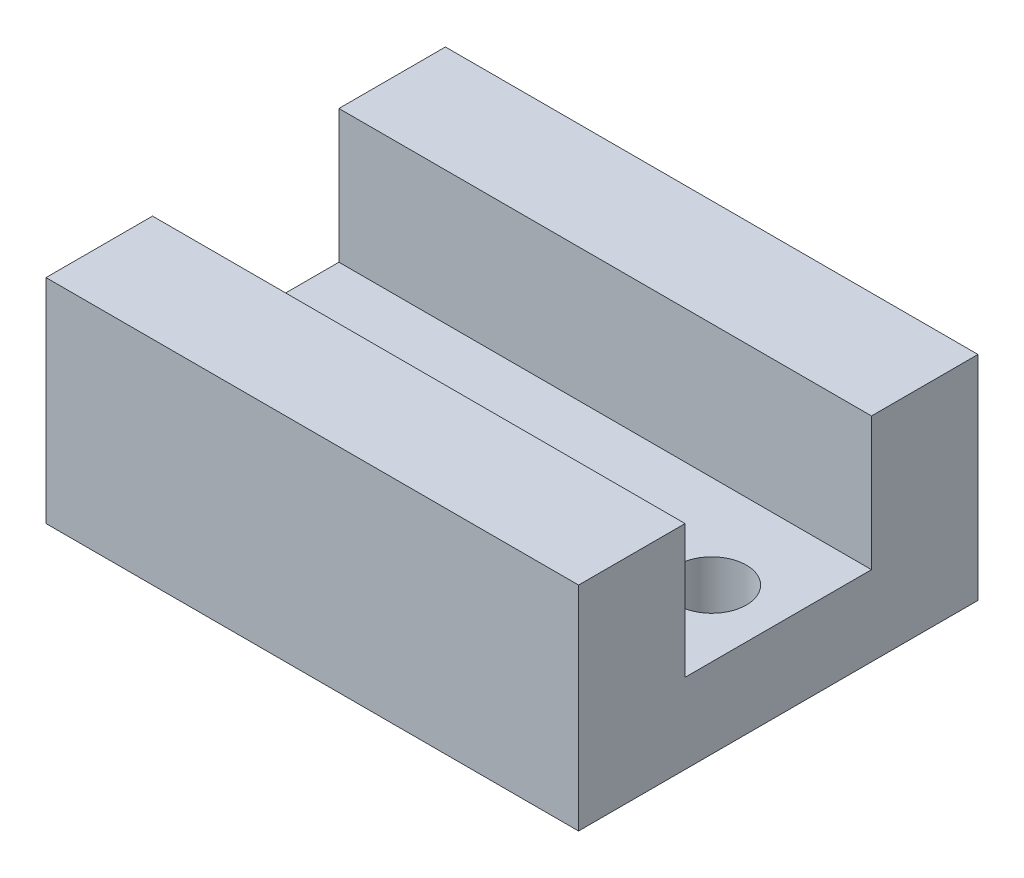
ISO-10303-21;
HEADER;
FILE_DESCRIPTION(('STEP AP214'),'2;1');
FILE_NAME('part.step','',(''),(''),'','','');
FILE_SCHEMA(('AUTOMOTIVE_DESIGN { 1 0 10303 214 1 1 1 1 }'));
ENDSEC;
DATA;
#1=APPLICATION_CONTEXT('core data for automotive mechanical design processes');
#2=APPLICATION_PROTOCOL_DEFINITION('international standard','automotive_design',2000,#1);
#3=PRODUCT_CONTEXT('',#1,'mechanical');
#4=PRODUCT('Part','Part','',(#3));
#5=PRODUCT_RELATED_PRODUCT_CATEGORY('part','',(#4));
#6=PRODUCT_DEFINITION_FORMATION('','',#4);
#7=PRODUCT_DEFINITION_CONTEXT('part definition',#1,'design');
#8=PRODUCT_DEFINITION('design','',#6,#7);
#9=PRODUCT_DEFINITION_SHAPE('','',#8);
#10=(LENGTH_UNIT() NAMED_UNIT(*) SI_UNIT(.MILLI.,.METRE.));
#11=(NAMED_UNIT(*) PLANE_ANGLE_UNIT() SI_UNIT($,.RADIAN.));
#12=(NAMED_UNIT(*) SI_UNIT($,.STERADIAN.) SOLID_ANGLE_UNIT());
#13=UNCERTAINTY_MEASURE_WITH_UNIT(LENGTH_MEASURE(1.E-05),#10,'distance_accuracy_value','');
#14=(GEOMETRIC_REPRESENTATION_CONTEXT(3) GLOBAL_UNCERTAINTY_ASSIGNED_CONTEXT((#13)) GLOBAL_UNIT_ASSIGNED_CONTEXT((#10,
#11,#12)) REPRESENTATION_CONTEXT('',''));
#15=CARTESIAN_POINT('',(0.,0.,0.));
#16=DIRECTION('',(0.,0.,1.));
#17=DIRECTION('',(1.,0.,0.));
#18=AXIS2_PLACEMENT_3D('',#15,#16,#17);
#19=CARTESIAN_POINT('',(0.,3.,0.));
#20=DIRECTION('',(0.,1.,0.));
#21=DIRECTION('',(0.,0.,1.));
#22=AXIS2_PLACEMENT_3D('',#19,#20,#21);
#23=PLANE('',#22);
#24=CARTESIAN_POINT('',(7.5,3.,0.));
#25=DIRECTION('',(0.,1.,0.));
#26=DIRECTION('',(0.,0.,1.));
#27=AXIS2_PLACEMENT_3D('',#24,#25,#26);
#28=CIRCLE('',#27,1.3);
#29=CARTESIAN_POINT('',(7.5,3.,1.3));
#30=VERTEX_POINT('',#29);
#31=EDGE_CURVE('E182',#30,#30,#28,.T.);
#32=ORIENTED_EDGE('',*,*,#31,.F.);
#33=EDGE_LOOP('',(#32));
#34=FACE_BOUND('',#33,.T.);
#35=CARTESIAN_POINT('',(-7.5,3.,0.));
#36=DIRECTION('',(0.,1.,0.));
#37=DIRECTION('',(0.,0.,1.));
#38=AXIS2_PLACEMENT_3D('',#35,#36,#37);
#39=CIRCLE('',#38,1.3);
#40=CARTESIAN_POINT('',(-7.5,3.,1.3));
#41=VERTEX_POINT('',#40);
#42=EDGE_CURVE('E174',#41,#41,#39,.T.);
#43=ORIENTED_EDGE('',*,*,#42,.F.);
#44=EDGE_LOOP('',(#43));
#45=FACE_BOUND('',#44,.T.);
#46=DIRECTION('',(0.,0.,1.));
#47=VECTOR('',#46,1.);
#48=CARTESIAN_POINT('',(-10.,3.,-7.5));
#49=LINE('',#48,#47);
#50=CARTESIAN_POINT('',(-10.,3.,-3.5));
#51=VERTEX_POINT('',#50);
#52=CARTESIAN_POINT('',(-10.,3.,3.5));
#53=VERTEX_POINT('',#52);
#54=EDGE_CURVE('E60',#51,#53,#49,.T.);
#55=ORIENTED_EDGE('',*,*,#54,.T.);
#56=DIRECTION('',(-1.,0.,0.));
#57=VECTOR('',#56,1.);
#58=CARTESIAN_POINT('',(-10.,3.,3.5));
#59=LINE('',#58,#57);
#60=CARTESIAN_POINT('',(10.,3.,3.5));
#61=VERTEX_POINT('',#60);
#62=EDGE_CURVE('E55',#61,#53,#59,.T.);
#63=ORIENTED_EDGE('',*,*,#62,.F.);
#64=DIRECTION('',(0.,0.,-1.));
#65=VECTOR('',#64,1.);
#66=CARTESIAN_POINT('',(10.,3.,-7.5));
#67=LINE('',#66,#65);
#68=CARTESIAN_POINT('',(10.,3.,-3.5));
#69=VERTEX_POINT('',#68);
#70=EDGE_CURVE('E190',#61,#69,#67,.T.);
#71=ORIENTED_EDGE('',*,*,#70,.T.);
#72=DIRECTION('',(1.,0.,0.));
#73=VECTOR('',#72,1.);
#74=CARTESIAN_POINT('',(-10.,3.,-3.5));
#75=LINE('',#74,#73);
#76=EDGE_CURVE('E146',#51,#69,#75,.T.);
#77=ORIENTED_EDGE('',*,*,#76,.F.);
#78=EDGE_LOOP('',(#55,#63,#71,#77));
#79=FACE_BOUND('',#78,.T.);
#80=ADVANCED_FACE('F39',(#34,#45,#79),#23,.T.);
#81=CARTESIAN_POINT('',(0.,0.,0.));
#82=DIRECTION('',(0.,1.,0.));
#83=DIRECTION('',(0.,0.,1.));
#84=AXIS2_PLACEMENT_3D('',#81,#82,#83);
#85=PLANE('',#84);
#86=DIRECTION('',(0.,0.,-1.));
#87=VECTOR('',#86,1.);
#88=CARTESIAN_POINT('',(10.,0.,-7.5));
#89=LINE('',#88,#87);
#90=CARTESIAN_POINT('',(10.,0.,7.5));
#91=VERTEX_POINT('',#90);
#92=CARTESIAN_POINT('',(10.,0.,-7.5));
#93=VERTEX_POINT('',#92);
#94=EDGE_CURVE('E186',#91,#93,#89,.T.);
#95=ORIENTED_EDGE('',*,*,#94,.F.);
#96=DIRECTION('',(1.,0.,0.));
#97=VECTOR('',#96,1.);
#98=CARTESIAN_POINT('',(-10.,0.,7.5));
#99=LINE('',#98,#97);
#100=CARTESIAN_POINT('',(-10.,0.,7.5));
#101=VERTEX_POINT('',#100);
#102=EDGE_CURVE('E193',#101,#91,#99,.T.);
#103=ORIENTED_EDGE('',*,*,#102,.F.);
#104=DIRECTION('',(0.,0.,1.));
#105=VECTOR('',#104,1.);
#106=CARTESIAN_POINT('',(-10.,0.,-7.5));
#107=LINE('',#106,#105);
#108=CARTESIAN_POINT('',(-10.,0.,-7.5));
#109=VERTEX_POINT('',#108);
#110=EDGE_CURVE('E111',#109,#101,#107,.T.);
#111=ORIENTED_EDGE('',*,*,#110,.F.);
#112=DIRECTION('',(-1.,0.,0.));
#113=VECTOR('',#112,1.);
#114=CARTESIAN_POINT('',(-10.,0.,-7.5));
#115=LINE('',#114,#113);
#116=EDGE_CURVE('E199',#93,#109,#115,.T.);
#117=ORIENTED_EDGE('',*,*,#116,.F.);
#118=EDGE_LOOP('',(#95,#103,#111,#117));
#119=FACE_BOUND('',#118,.T.);
#120=CARTESIAN_POINT('',(7.5,0.,0.));
#121=DIRECTION('',(0.,1.,0.));
#122=DIRECTION('',(0.,0.,1.));
#123=AXIS2_PLACEMENT_3D('',#120,#121,#122);
#124=CIRCLE('',#123,1.3);
#125=CARTESIAN_POINT('',(7.5,0.,1.3));
#126=VERTEX_POINT('',#125);
#127=EDGE_CURVE('E178',#126,#126,#124,.T.);
#128=ORIENTED_EDGE('',*,*,#127,.T.);
#129=EDGE_LOOP('',(#128));
#130=FACE_BOUND('',#129,.T.);
#131=CARTESIAN_POINT('',(-7.5,0.,0.));
#132=DIRECTION('',(0.,1.,0.));
#133=DIRECTION('',(0.,0.,1.));
#134=AXIS2_PLACEMENT_3D('',#131,#132,#133);
#135=CIRCLE('',#134,1.3);
#136=CARTESIAN_POINT('',(-7.5,0.,1.3));
#137=VERTEX_POINT('',#136);
#138=EDGE_CURVE('E173',#137,#137,#135,.T.);
#139=ORIENTED_EDGE('',*,*,#138,.T.);
#140=EDGE_LOOP('',(#139));
#141=FACE_BOUND('',#140,.T.);
#142=ADVANCED_FACE('F214',(#119,#130,#141),#85,.F.);
#143=CARTESIAN_POINT('',(10.,3.,-7.5));
#144=DIRECTION('',(-1.,0.,0.));
#145=DIRECTION('',(0.,0.,1.));
#146=AXIS2_PLACEMENT_3D('',#143,#144,#145);
#147=PLANE('',#146);
#148=ORIENTED_EDGE('',*,*,#94,.T.);
#149=DIRECTION('',(0.,-1.,0.));
#150=VECTOR('',#149,1.);
#151=CARTESIAN_POINT('',(10.,3.,-7.5));
#152=LINE('',#151,#150);
#153=CARTESIAN_POINT('',(10.,8.,-7.5));
#154=VERTEX_POINT('',#153);
#155=EDGE_CURVE('E11',#154,#93,#152,.T.);
#156=ORIENTED_EDGE('',*,*,#155,.F.);
#157=DIRECTION('',(0.,0.,-1.));
#158=VECTOR('',#157,1.);
#159=CARTESIAN_POINT('',(10.,8.,-7.5));
#160=LINE('',#159,#158);
#161=CARTESIAN_POINT('',(10.,8.,-3.5));
#162=VERTEX_POINT('',#161);
#163=EDGE_CURVE('E154',#162,#154,#160,.T.);
#164=ORIENTED_EDGE('',*,*,#163,.F.);
#165=DIRECTION('',(0.,-1.,0.));
#166=VECTOR('',#165,1.);
#167=CARTESIAN_POINT('',(10.,8.,-3.5));
#168=LINE('',#167,#166);
#169=EDGE_CURVE('E162',#162,#69,#168,.T.);
#170=ORIENTED_EDGE('',*,*,#169,.T.);
#171=ORIENTED_EDGE('',*,*,#70,.F.);
#172=DIRECTION('',(0.,-1.,0.));
#173=VECTOR('',#172,1.);
#174=CARTESIAN_POINT('',(10.,8.,3.5));
#175=LINE('',#174,#173);
#176=CARTESIAN_POINT('',(10.,8.,3.5));
#177=VERTEX_POINT('',#176);
#178=EDGE_CURVE('E142',#177,#61,#175,.T.);
#179=ORIENTED_EDGE('',*,*,#178,.F.);
#180=DIRECTION('',(0.,0.,-1.));
#181=VECTOR('',#180,1.);
#182=CARTESIAN_POINT('',(10.,8.,7.5));
#183=LINE('',#182,#181);
#184=CARTESIAN_POINT('',(10.,8.,7.5));
#185=VERTEX_POINT('',#184);
#186=EDGE_CURVE('E124',#185,#177,#183,.T.);
#187=ORIENTED_EDGE('',*,*,#186,.F.);
#188=DIRECTION('',(0.,-1.,0.));
#189=VECTOR('',#188,1.);
#190=CARTESIAN_POINT('',(10.,3.,7.5));
#191=LINE('',#190,#189);
#192=EDGE_CURVE('E115',#185,#91,#191,.T.);
#193=ORIENTED_EDGE('',*,*,#192,.T.);
#194=EDGE_LOOP('',(#148,#156,#164,#170,#171,#179,#187,#193));
#195=FACE_BOUND('',#194,.T.);
#196=ADVANCED_FACE('F41',(#195),#147,.F.);
#197=CARTESIAN_POINT('',(-10.,3.,-7.5));
#198=DIRECTION('',(0.,0.,1.));
#199=DIRECTION('',(1.,0.,0.));
#200=AXIS2_PLACEMENT_3D('',#197,#198,#199);
#201=PLANE('',#200);
#202=ORIENTED_EDGE('',*,*,#116,.T.);
#203=DIRECTION('',(0.,-1.,0.));
#204=VECTOR('',#203,1.);
#205=CARTESIAN_POINT('',(-10.,3.,-7.5));
#206=LINE('',#205,#204);
#207=CARTESIAN_POINT('',(-10.,8.,-7.5));
#208=VERTEX_POINT('',#207);
#209=EDGE_CURVE('E48',#208,#109,#206,.T.);
#210=ORIENTED_EDGE('',*,*,#209,.F.);
#211=DIRECTION('',(-1.,0.,0.));
#212=VECTOR('',#211,1.);
#213=CARTESIAN_POINT('',(-10.,8.,-7.5));
#214=LINE('',#213,#212);
#215=EDGE_CURVE('E158',#154,#208,#214,.T.);
#216=ORIENTED_EDGE('',*,*,#215,.F.);
#217=ORIENTED_EDGE('',*,*,#155,.T.);
#218=EDGE_LOOP('',(#202,#210,#216,#217));
#219=FACE_BOUND('',#218,.T.);
#220=ADVANCED_FACE('F226',(#219),#201,.F.);
#221=CARTESIAN_POINT('',(-10.,3.,-7.5));
#222=DIRECTION('',(1.,0.,0.));
#223=DIRECTION('',(0.,0.,-1.));
#224=AXIS2_PLACEMENT_3D('',#221,#222,#223);
#225=PLANE('',#224);
#226=ORIENTED_EDGE('',*,*,#110,.T.);
#227=DIRECTION('',(0.,-1.,0.));
#228=VECTOR('',#227,1.);
#229=CARTESIAN_POINT('',(-10.,3.,7.5));
#230=LINE('',#229,#228);
#231=CARTESIAN_POINT('',(-10.,8.,7.5));
#232=VERTEX_POINT('',#231);
#233=EDGE_CURVE('E103',#232,#101,#230,.T.);
#234=ORIENTED_EDGE('',*,*,#233,.F.);
#235=DIRECTION('',(0.,0.,1.));
#236=VECTOR('',#235,1.);
#237=CARTESIAN_POINT('',(-10.,8.,7.5));
#238=LINE('',#237,#236);
#239=CARTESIAN_POINT('',(-10.,8.,3.5));
#240=VERTEX_POINT('',#239);
#241=EDGE_CURVE('E108',#240,#232,#238,.T.);
#242=ORIENTED_EDGE('',*,*,#241,.F.);
#243=DIRECTION('',(0.,-1.,0.));
#244=VECTOR('',#243,1.);
#245=CARTESIAN_POINT('',(-10.,8.,3.5));
#246=LINE('',#245,#244);
#247=EDGE_CURVE('E138',#240,#53,#246,.T.);
#248=ORIENTED_EDGE('',*,*,#247,.T.);
#249=ORIENTED_EDGE('',*,*,#54,.F.);
#250=DIRECTION('',(0.,-1.,0.));
#251=VECTOR('',#250,1.);
#252=CARTESIAN_POINT('',(-10.,8.,-3.5));
#253=LINE('',#252,#251);
#254=CARTESIAN_POINT('',(-10.,8.,-3.5));
#255=VERTEX_POINT('',#254);
#256=EDGE_CURVE('E169',#255,#51,#253,.T.);
#257=ORIENTED_EDGE('',*,*,#256,.F.);
#258=DIRECTION('',(0.,0.,1.));
#259=VECTOR('',#258,1.);
#260=CARTESIAN_POINT('',(-10.,8.,-7.5));
#261=LINE('',#260,#259);
#262=EDGE_CURVE('E147',#208,#255,#261,.T.);
#263=ORIENTED_EDGE('',*,*,#262,.F.);
#264=ORIENTED_EDGE('',*,*,#209,.T.);
#265=EDGE_LOOP('',(#226,#234,#242,#248,#249,#257,#263,#264));
#266=FACE_BOUND('',#265,.T.);
#267=ADVANCED_FACE('F105',(#266),#225,.F.);
#268=CARTESIAN_POINT('',(-10.,3.,7.5));
#269=DIRECTION('',(0.,0.,-1.));
#270=DIRECTION('',(-1.,0.,0.));
#271=AXIS2_PLACEMENT_3D('',#268,#269,#270);
#272=PLANE('',#271);
#273=ORIENTED_EDGE('',*,*,#102,.T.);
#274=ORIENTED_EDGE('',*,*,#192,.F.);
#275=DIRECTION('',(1.,0.,0.));
#276=VECTOR('',#275,1.);
#277=CARTESIAN_POINT('',(-10.,8.,7.5));
#278=LINE('',#277,#276);
#279=EDGE_CURVE('E118',#232,#185,#278,.T.);
#280=ORIENTED_EDGE('',*,*,#279,.F.);
#281=ORIENTED_EDGE('',*,*,#233,.T.);
#282=EDGE_LOOP('',(#273,#274,#280,#281));
#283=FACE_BOUND('',#282,.T.);
#284=ADVANCED_FACE('F119',(#283),#272,.F.);
#285=CARTESIAN_POINT('',(7.5,3.,0.));
#286=DIRECTION('',(0.,-1.,0.));
#287=DIRECTION('',(0.,0.,-1.));
#288=AXIS2_PLACEMENT_3D('',#285,#286,#287);
#289=CYLINDRICAL_SURFACE('',#288,1.3);
#290=ORIENTED_EDGE('',*,*,#31,.T.);
#291=EDGE_LOOP('',(#290));
#292=FACE_BOUND('',#291,.T.);
#293=ORIENTED_EDGE('',*,*,#127,.F.);
#294=EDGE_LOOP('',(#293));
#295=FACE_BOUND('',#294,.T.);
#296=ADVANCED_FACE('F243',(#292,#295),#289,.F.);
#297=CARTESIAN_POINT('',(-7.5,3.,0.));
#298=DIRECTION('',(0.,-1.,0.));
#299=DIRECTION('',(0.,0.,-1.));
#300=AXIS2_PLACEMENT_3D('',#297,#298,#299);
#301=CYLINDRICAL_SURFACE('',#300,1.3);
#302=ORIENTED_EDGE('',*,*,#42,.T.);
#303=EDGE_LOOP('',(#302));
#304=FACE_BOUND('',#303,.T.);
#305=ORIENTED_EDGE('',*,*,#138,.F.);
#306=EDGE_LOOP('',(#305));
#307=FACE_BOUND('',#306,.T.);
#308=ADVANCED_FACE('F250',(#304,#307),#301,.F.);
#309=CARTESIAN_POINT('',(-10.,8.,-3.5));
#310=DIRECTION('',(0.,0.,-1.));
#311=DIRECTION('',(-1.,0.,0.));
#312=AXIS2_PLACEMENT_3D('',#309,#310,#311);
#313=PLANE('',#312);
#314=ORIENTED_EDGE('',*,*,#76,.T.);
#315=ORIENTED_EDGE('',*,*,#169,.F.);
#316=DIRECTION('',(1.,0.,0.));
#317=VECTOR('',#316,1.);
#318=CARTESIAN_POINT('',(-10.,8.,-3.5));
#319=LINE('',#318,#317);
#320=EDGE_CURVE('E151',#255,#162,#319,.T.);
#321=ORIENTED_EDGE('',*,*,#320,.F.);
#322=ORIENTED_EDGE('',*,*,#256,.T.);
#323=EDGE_LOOP('',(#314,#315,#321,#322));
#324=FACE_BOUND('',#323,.T.);
#325=ADVANCED_FACE('F221',(#324),#313,.F.);
#326=CARTESIAN_POINT('',(0.,8.,0.));
#327=DIRECTION('',(0.,1.,0.));
#328=DIRECTION('',(0.,0.,1.));
#329=AXIS2_PLACEMENT_3D('',#326,#327,#328);
#330=PLANE('',#329);
#331=ORIENTED_EDGE('',*,*,#262,.T.);
#332=ORIENTED_EDGE('',*,*,#320,.T.);
#333=ORIENTED_EDGE('',*,*,#163,.T.);
#334=ORIENTED_EDGE('',*,*,#215,.T.);
#335=EDGE_LOOP('',(#331,#332,#333,#334));
#336=FACE_BOUND('',#335,.T.);
#337=ADVANCED_FACE('F225',(#336),#330,.T.);
#338=CARTESIAN_POINT('',(-10.,8.,3.5));
#339=DIRECTION('',(0.,0.,1.));
#340=DIRECTION('',(1.,0.,0.));
#341=AXIS2_PLACEMENT_3D('',#338,#339,#340);
#342=PLANE('',#341);
#343=ORIENTED_EDGE('',*,*,#62,.T.);
#344=ORIENTED_EDGE('',*,*,#247,.F.);
#345=DIRECTION('',(-1.,0.,0.));
#346=VECTOR('',#345,1.);
#347=CARTESIAN_POINT('',(-10.,8.,3.5));
#348=LINE('',#347,#346);
#349=EDGE_CURVE('E128',#177,#240,#348,.T.);
#350=ORIENTED_EDGE('',*,*,#349,.F.);
#351=ORIENTED_EDGE('',*,*,#178,.T.);
#352=EDGE_LOOP('',(#343,#344,#350,#351));
#353=FACE_BOUND('',#352,.T.);
#354=ADVANCED_FACE('F219',(#353),#342,.F.);
#355=CARTESIAN_POINT('',(0.,8.,0.));
#356=DIRECTION('',(0.,-1.,0.));
#357=DIRECTION('',(0.,0.,-1.));
#358=AXIS2_PLACEMENT_3D('',#355,#356,#357);
#359=PLANE('',#358);
#360=ORIENTED_EDGE('',*,*,#241,.T.);
#361=ORIENTED_EDGE('',*,*,#279,.T.);
#362=ORIENTED_EDGE('',*,*,#186,.T.);
#363=ORIENTED_EDGE('',*,*,#349,.T.);
#364=EDGE_LOOP('',(#360,#361,#362,#363));
#365=FACE_BOUND('',#364,.T.);
#366=ADVANCED_FACE('F126',(#365),#359,.F.);
#367=CLOSED_SHELL('',(#80,#142,#196,#220,#267,#284,#296,#308,#325,#337,#354,#366));
#368=MANIFOLD_SOLID_BREP('B2',#367);
#369=ADVANCED_BREP_SHAPE_REPRESENTATION('',(#18,#368),#14);
#370=SHAPE_DEFINITION_REPRESENTATION(#9,#369);
ENDSEC;
END-ISO-10303-21;
